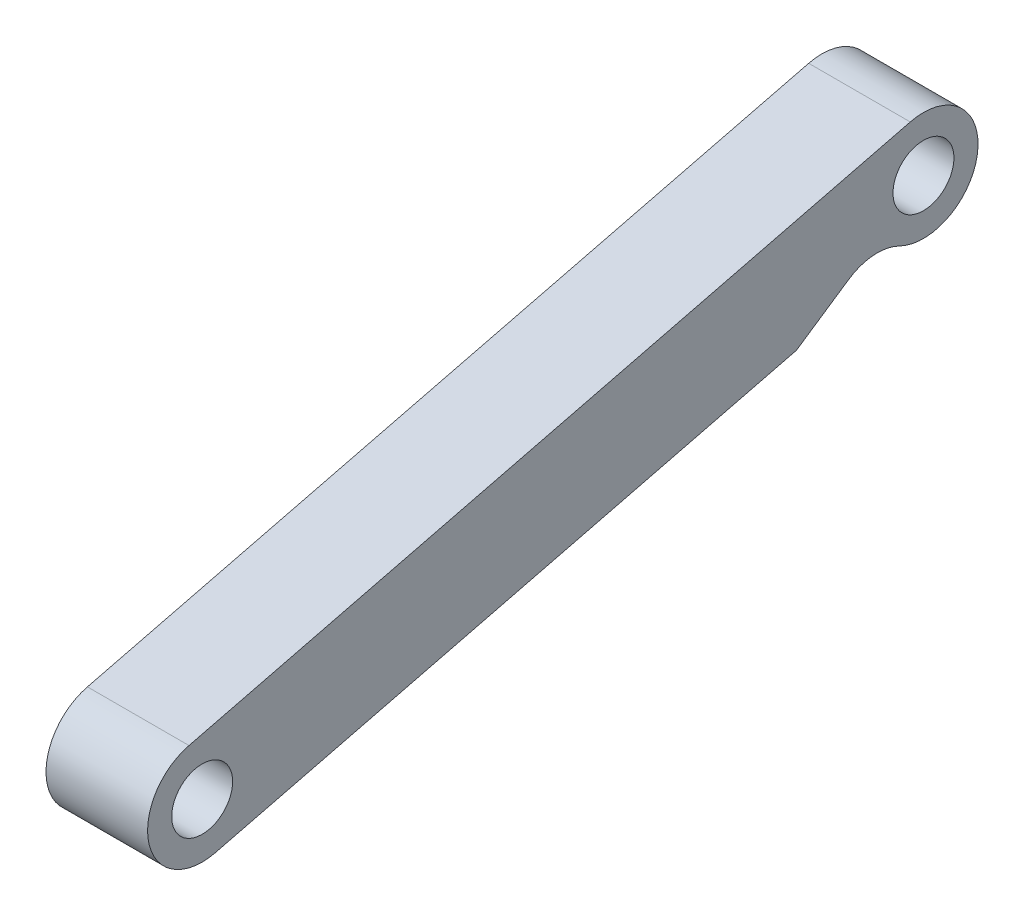
ISO-10303-21;
HEADER;
FILE_DESCRIPTION(('STEP AP214'),'2;1');
FILE_NAME('part.step','',(''),(''),'','','');
FILE_SCHEMA(('AUTOMOTIVE_DESIGN { 1 0 10303 214 1 1 1 1 }'));
ENDSEC;
DATA;
#1=APPLICATION_CONTEXT('core data for automotive mechanical design processes');
#2=APPLICATION_PROTOCOL_DEFINITION('international standard','automotive_design',2000,#1);
#3=PRODUCT_CONTEXT('',#1,'mechanical');
#4=PRODUCT('Part','Part','',(#3));
#5=PRODUCT_RELATED_PRODUCT_CATEGORY('part','',(#4));
#6=PRODUCT_DEFINITION_FORMATION('','',#4);
#7=PRODUCT_DEFINITION_CONTEXT('part definition',#1,'design');
#8=PRODUCT_DEFINITION('design','',#6,#7);
#9=PRODUCT_DEFINITION_SHAPE('','',#8);
#10=(LENGTH_UNIT() NAMED_UNIT(*) SI_UNIT(.MILLI.,.METRE.));
#11=(NAMED_UNIT(*) PLANE_ANGLE_UNIT() SI_UNIT($,.RADIAN.));
#12=(NAMED_UNIT(*) SI_UNIT($,.STERADIAN.) SOLID_ANGLE_UNIT());
#13=UNCERTAINTY_MEASURE_WITH_UNIT(LENGTH_MEASURE(1.E-05),#10,'distance_accuracy_value','');
#14=(GEOMETRIC_REPRESENTATION_CONTEXT(3) GLOBAL_UNCERTAINTY_ASSIGNED_CONTEXT((#13)) GLOBAL_UNIT_ASSIGNED_CONTEXT((#10,
#11,#12)) REPRESENTATION_CONTEXT('',''));
#15=CARTESIAN_POINT('',(0.,0.,0.));
#16=DIRECTION('',(0.,0.,1.));
#17=DIRECTION('',(1.,0.,0.));
#18=AXIS2_PLACEMENT_3D('',#15,#16,#17);
#19=CARTESIAN_POINT('',(-2.,-11.142986567367,-2.77146766811159));
#20=DIRECTION('',(0.,-0.970434393018363,-0.241365053077453));
#21=DIRECTION('',(0.,0.241365053077453,-0.970434393018363));
#22=AXIS2_PLACEMENT_3D('',#19,#20,#21);
#23=PLANE('',#22);
#24=DIRECTION('',(1.,0.,0.));
#25=VECTOR('',#24,1.);
#26=CARTESIAN_POINT('',(-2.,-1.91356605501053,-39.879354574779));
#27=LINE('',#26,#25);
#28=CARTESIAN_POINT('',(-2.,-1.91356605501053,-39.879354574779));
#29=VERTEX_POINT('',#28);
#30=CARTESIAN_POINT('',(2.,-1.91356605501053,-39.879354574779));
#31=VERTEX_POINT('',#30);
#32=EDGE_CURVE('E41',#29,#31,#27,.T.);
#33=ORIENTED_EDGE('',*,*,#32,.T.);
#34=DIRECTION('',(0.,0.241365053077453,-0.970434393018363));
#35=VECTOR('',#34,1.);
#36=CARTESIAN_POINT('',(2.,-11.142986567367,-2.77146766811159));
#37=LINE('',#36,#35);
#38=CARTESIAN_POINT('',(2.,5.15061171746536,-68.2816480360722));
#39=VERTEX_POINT('',#38);
#40=EDGE_CURVE('E94',#31,#39,#37,.T.);
#41=ORIENTED_EDGE('',*,*,#40,.T.);
#42=DIRECTION('',(1.,0.,0.));
#43=VECTOR('',#42,1.);
#44=CARTESIAN_POINT('',(-2.,5.15061171746536,-68.2816480360722));
#45=LINE('',#44,#43);
#46=CARTESIAN_POINT('',(-2.,5.15061171746536,-68.2816480360722));
#47=VERTEX_POINT('',#46);
#48=EDGE_CURVE('E11',#47,#39,#45,.T.);
#49=ORIENTED_EDGE('',*,*,#48,.F.);
#50=DIRECTION('',(0.,0.241365053077453,-0.970434393018363));
#51=VECTOR('',#50,1.);
#52=CARTESIAN_POINT('',(-2.,-11.142986567367,-2.77146766811159));
#53=LINE('',#52,#51);
#54=EDGE_CURVE('E54',#29,#47,#53,.T.);
#55=ORIENTED_EDGE('',*,*,#54,.F.);
#56=EDGE_LOOP('',(#33,#41,#49,#55));
#57=FACE_BOUND('',#56,.T.);
#58=ADVANCED_FACE('F38',(#57),#23,.F.);
#59=CARTESIAN_POINT('',(-2.,3.06417777247588,-68.8005829001888));
#60=DIRECTION('',(1.,0.,0.));
#61=DIRECTION('',(0.,0.,-1.));
#62=AXIS2_PLACEMENT_3D('',#59,#60,#61);
#63=CYLINDRICAL_SURFACE('',#62,2.15);
#64=ORIENTED_EDGE('',*,*,#48,.T.);
#65=CARTESIAN_POINT('',(2.,3.06417777247588,-68.8005829001888));
#66=DIRECTION('',(1.,0.,0.));
#67=DIRECTION('',(0.,0.,-1.));
#68=AXIS2_PLACEMENT_3D('',#65,#66,#67);
#69=CIRCLE('',#68,2.15);
#70=CARTESIAN_POINT('',(2.,1.13224759562641,-67.8571075206593));
#71=VERTEX_POINT('',#70);
#72=EDGE_CURVE('E111',#71,#39,#69,.T.);
#73=ORIENTED_EDGE('',*,*,#72,.F.);
#74=DIRECTION('',(1.,0.,0.));
#75=VECTOR('',#74,1.);
#76=CARTESIAN_POINT('',(-2.,1.13224759562641,-67.8571075206593));
#77=LINE('',#76,#75);
#78=CARTESIAN_POINT('',(-2.,1.13224759562641,-67.8571075206593));
#79=VERTEX_POINT('',#78);
#80=EDGE_CURVE('E46',#79,#71,#77,.T.);
#81=ORIENTED_EDGE('',*,*,#80,.F.);
#82=CARTESIAN_POINT('',(-2.,3.06417777247588,-68.8005829001888));
#83=DIRECTION('',(1.,0.,0.));
#84=DIRECTION('',(0.,0.,-1.));
#85=AXIS2_PLACEMENT_3D('',#82,#83,#84);
#86=CIRCLE('',#85,2.15);
#87=EDGE_CURVE('E139',#79,#47,#86,.T.);
#88=ORIENTED_EDGE('',*,*,#87,.T.);
#89=EDGE_LOOP('',(#64,#73,#81,#88));
#90=FACE_BOUND('',#89,.T.);
#91=ADVANCED_FACE('F160',(#90),#63,.T.);
#92=CARTESIAN_POINT('',(-2.,-0.664896754931248,-66.9794560048178));
#93=DIRECTION('',(1.,0.,0.));
#94=DIRECTION('',(0.,0.,-1.));
#95=AXIS2_PLACEMENT_3D('',#92,#93,#94);
#96=CYLINDRICAL_SURFACE('',#95,2.);
#97=ORIENTED_EDGE('',*,*,#80,.T.);
#98=CARTESIAN_POINT('',(2.,-0.664896754931248,-66.9794560048178));
#99=DIRECTION('',(1.,0.,0.));
#100=DIRECTION('',(0.,0.,-1.));
#101=AXIS2_PLACEMENT_3D('',#98,#99,#100);
#102=CIRCLE('',#101,2.);
#103=CARTESIAN_POINT('',(2.,0.993819901126462,-65.8620218658563));
#104=VERTEX_POINT('',#103);
#105=EDGE_CURVE('E118',#71,#104,#102,.T.);
#106=ORIENTED_EDGE('',*,*,#105,.T.);
#107=DIRECTION('',(1.,0.,0.));
#108=VECTOR('',#107,1.);
#109=CARTESIAN_POINT('',(-2.,0.993819901126462,-65.8620218658563));
#110=LINE('',#109,#108);
#111=CARTESIAN_POINT('',(-2.,0.993819901126462,-65.8620218658563));
#112=VERTEX_POINT('',#111);
#113=EDGE_CURVE('E147',#112,#104,#110,.T.);
#114=ORIENTED_EDGE('',*,*,#113,.F.);
#115=CARTESIAN_POINT('',(-2.,-0.664896754931248,-66.9794560048178));
#116=DIRECTION('',(1.,0.,0.));
#117=DIRECTION('',(0.,0.,-1.));
#118=AXIS2_PLACEMENT_3D('',#115,#116,#117);
#119=CIRCLE('',#118,2.);
#120=EDGE_CURVE('E137',#79,#112,#119,.T.);
#121=ORIENTED_EDGE('',*,*,#120,.F.);
#122=EDGE_LOOP('',(#97,#106,#114,#121));
#123=FACE_BOUND('',#122,.T.);
#124=ADVANCED_FACE('F159',(#123),#96,.F.);
#125=CARTESIAN_POINT('',(-2.,-29.8353390099526,-20.0992895534372));
#126=DIRECTION('',(0.,-0.829358328028849,-0.558717069480781));
#127=DIRECTION('',(0.,0.558717069480781,-0.829358328028849));
#128=AXIS2_PLACEMENT_3D('',#125,#126,#127);
#129=PLANE('',#128);
#130=ORIENTED_EDGE('',*,*,#113,.T.);
#131=DIRECTION('',(0.,0.558717069480781,-0.829358328028849));
#132=VECTOR('',#131,1.);
#133=CARTESIAN_POINT('',(2.,-29.8353390099526,-20.0992895534372));
#134=LINE('',#133,#132);
#135=CARTESIAN_POINT('',(2.,-0.394917751690836,-63.8005829001888));
#136=VERTEX_POINT('',#135);
#137=EDGE_CURVE('E115',#136,#104,#134,.T.);
#138=ORIENTED_EDGE('',*,*,#137,.F.);
#139=DIRECTION('',(1.,0.,0.));
#140=VECTOR('',#139,1.);
#141=CARTESIAN_POINT('',(-2.,-0.394917751690836,-63.8005829001888));
#142=LINE('',#141,#140);
#143=CARTESIAN_POINT('',(-2.,-0.394917751690836,-63.8005829001888));
#144=VERTEX_POINT('',#143);
#145=EDGE_CURVE('E149',#144,#136,#142,.T.);
#146=ORIENTED_EDGE('',*,*,#145,.F.);
#147=DIRECTION('',(0.,0.558717069480781,-0.829358328028849));
#148=VECTOR('',#147,1.);
#149=CARTESIAN_POINT('',(-2.,-29.8353390099526,-20.0992895534372));
#150=LINE('',#149,#148);
#151=EDGE_CURVE('E134',#144,#112,#150,.T.);
#152=ORIENTED_EDGE('',*,*,#151,.T.);
#153=EDGE_LOOP('',(#130,#138,#146,#152));
#154=FACE_BOUND('',#153,.T.);
#155=ADVANCED_FACE('F156',(#154),#129,.T.);
#156=CARTESIAN_POINT('',(-2.,-15.315854457346,-3.80933739634463));
#157=DIRECTION('',(0.,-0.970434393018363,-0.241365053077453));
#158=DIRECTION('',(0.,0.241365053077453,-0.970434393018363));
#159=AXIS2_PLACEMENT_3D('',#156,#157,#158);
#160=PLANE('',#159);
#161=ORIENTED_EDGE('',*,*,#145,.T.);
#162=DIRECTION('',(0.,0.241365053077453,-0.970434393018363));
#163=VECTOR('',#162,1.);
#164=CARTESIAN_POINT('',(2.,-15.315854457346,-3.80933739634463));
#165=LINE('',#164,#163);
#166=CARTESIAN_POINT('',(2.,-6.08643394498948,-40.917224303012));
#167=VERTEX_POINT('',#166);
#168=EDGE_CURVE('E105',#167,#136,#165,.T.);
#169=ORIENTED_EDGE('',*,*,#168,.F.);
#170=DIRECTION('',(1.,0.,0.));
#171=VECTOR('',#170,1.);
#172=CARTESIAN_POINT('',(-2.,-6.08643394498948,-40.917224303012));
#173=LINE('',#172,#171);
#174=CARTESIAN_POINT('',(-2.,-6.08643394498948,-40.917224303012));
#175=VERTEX_POINT('',#174);
#176=EDGE_CURVE('E97',#175,#167,#173,.T.);
#177=ORIENTED_EDGE('',*,*,#176,.F.);
#178=DIRECTION('',(0.,0.241365053077453,-0.970434393018363));
#179=VECTOR('',#178,1.);
#180=CARTESIAN_POINT('',(-2.,-15.315854457346,-3.80933739634463));
#181=LINE('',#180,#179);
#182=EDGE_CURVE('E131',#175,#144,#181,.T.);
#183=ORIENTED_EDGE('',*,*,#182,.T.);
#184=EDGE_LOOP('',(#161,#169,#177,#183));
#185=FACE_BOUND('',#184,.T.);
#186=ADVANCED_FACE('F151',(#185),#160,.T.);
#187=CARTESIAN_POINT('',(-2.,3.06417777247588,-68.8005829001888));
#188=DIRECTION('',(1.,0.,0.));
#189=DIRECTION('',(0.,0.,-1.));
#190=AXIS2_PLACEMENT_3D('',#187,#188,#189);
#191=CYLINDRICAL_SURFACE('',#190,1.2);
#192=CARTESIAN_POINT('',(-2.,3.06417777247588,-68.8005829001888));
#193=DIRECTION('',(1.,0.,0.));
#194=DIRECTION('',(0.,0.,-1.));
#195=AXIS2_PLACEMENT_3D('',#192,#193,#194);
#196=CIRCLE('',#195,1.2);
#197=CARTESIAN_POINT('',(-2.,3.06417777247588,-70.0005829001888));
#198=VERTEX_POINT('',#197);
#199=EDGE_CURVE('E141',#198,#198,#196,.T.);
#200=ORIENTED_EDGE('',*,*,#199,.F.);
#201=EDGE_LOOP('',(#200));
#202=FACE_BOUND('',#201,.T.);
#203=CARTESIAN_POINT('',(2.,3.06417777247588,-68.8005829001888));
#204=DIRECTION('',(1.,0.,0.));
#205=DIRECTION('',(0.,0.,-1.));
#206=AXIS2_PLACEMENT_3D('',#203,#204,#205);
#207=CIRCLE('',#206,1.2);
#208=CARTESIAN_POINT('',(2.,3.06417777247588,-70.0005829001888));
#209=VERTEX_POINT('',#208);
#210=EDGE_CURVE('E122',#209,#209,#207,.T.);
#211=ORIENTED_EDGE('',*,*,#210,.T.);
#212=EDGE_LOOP('',(#211));
#213=FACE_BOUND('',#212,.T.);
#214=ADVANCED_FACE('F189',(#202,#213),#191,.F.);
#215=CARTESIAN_POINT('',(-2.,-4.00000000000001,-40.3982894388955));
#216=DIRECTION('',(1.,0.,0.));
#217=DIRECTION('',(0.,0.,-1.));
#218=AXIS2_PLACEMENT_3D('',#215,#216,#217);
#219=CYLINDRICAL_SURFACE('',#218,2.15);
#220=ORIENTED_EDGE('',*,*,#176,.T.);
#221=CARTESIAN_POINT('',(2.,-4.00000000000001,-40.3982894388955));
#222=DIRECTION('',(1.,0.,0.));
#223=DIRECTION('',(0.,0.,-1.));
#224=AXIS2_PLACEMENT_3D('',#221,#222,#223);
#225=CIRCLE('',#224,2.15);
#226=EDGE_CURVE('E100',#31,#167,#225,.T.);
#227=ORIENTED_EDGE('',*,*,#226,.F.);
#228=ORIENTED_EDGE('',*,*,#32,.F.);
#229=CARTESIAN_POINT('',(-2.,-4.00000000000001,-40.3982894388955));
#230=DIRECTION('',(1.,0.,0.));
#231=DIRECTION('',(0.,0.,-1.));
#232=AXIS2_PLACEMENT_3D('',#229,#230,#231);
#233=CIRCLE('',#232,2.15);
#234=EDGE_CURVE('E129',#29,#175,#233,.T.);
#235=ORIENTED_EDGE('',*,*,#234,.T.);
#236=EDGE_LOOP('',(#220,#227,#228,#235));
#237=FACE_BOUND('',#236,.T.);
#238=ADVANCED_FACE('F101',(#237),#219,.T.);
#239=CARTESIAN_POINT('',(-2.,-4.00000000000001,-40.3982894388955));
#240=DIRECTION('',(1.,0.,0.));
#241=DIRECTION('',(0.,0.,-1.));
#242=AXIS2_PLACEMENT_3D('',#239,#240,#241);
#243=CYLINDRICAL_SURFACE('',#242,1.2);
#244=CARTESIAN_POINT('',(-2.,-4.00000000000001,-40.3982894388955));
#245=DIRECTION('',(1.,0.,0.));
#246=DIRECTION('',(0.,0.,-1.));
#247=AXIS2_PLACEMENT_3D('',#244,#245,#246);
#248=CIRCLE('',#247,1.2);
#249=CARTESIAN_POINT('',(-2.,-4.00000000000001,-41.5982894388955));
#250=VERTEX_POINT('',#249);
#251=EDGE_CURVE('E98',#250,#250,#248,.T.);
#252=ORIENTED_EDGE('',*,*,#251,.F.);
#253=EDGE_LOOP('',(#252));
#254=FACE_BOUND('',#253,.T.);
#255=CARTESIAN_POINT('',(2.,-4.00000000000001,-40.3982894388955));
#256=DIRECTION('',(1.,0.,0.));
#257=DIRECTION('',(0.,0.,-1.));
#258=AXIS2_PLACEMENT_3D('',#255,#256,#257);
#259=CIRCLE('',#258,1.2);
#260=CARTESIAN_POINT('',(2.,-4.00000000000001,-41.5982894388955));
#261=VERTEX_POINT('',#260);
#262=EDGE_CURVE('E125',#261,#261,#259,.T.);
#263=ORIENTED_EDGE('',*,*,#262,.T.);
#264=EDGE_LOOP('',(#263));
#265=FACE_BOUND('',#264,.T.);
#266=ADVANCED_FACE('F164',(#254,#265),#243,.F.);
#267=CARTESIAN_POINT('',(-2.,0.,0.));
#268=DIRECTION('',(1.,0.,0.));
#269=DIRECTION('',(0.,0.,-1.));
#270=AXIS2_PLACEMENT_3D('',#267,#268,#269);
#271=PLANE('',#270);
#272=ORIENTED_EDGE('',*,*,#54,.T.);
#273=ORIENTED_EDGE('',*,*,#87,.F.);
#274=ORIENTED_EDGE('',*,*,#120,.T.);
#275=ORIENTED_EDGE('',*,*,#151,.F.);
#276=ORIENTED_EDGE('',*,*,#182,.F.);
#277=ORIENTED_EDGE('',*,*,#234,.F.);
#278=EDGE_LOOP('',(#272,#273,#274,#275,#276,#277));
#279=FACE_BOUND('',#278,.T.);
#280=ORIENTED_EDGE('',*,*,#199,.T.);
#281=EDGE_LOOP('',(#280));
#282=FACE_BOUND('',#281,.T.);
#283=ORIENTED_EDGE('',*,*,#251,.T.);
#284=EDGE_LOOP('',(#283));
#285=FACE_BOUND('',#284,.T.);
#286=ADVANCED_FACE('F161',(#279,#282,#285),#271,.F.);
#287=CARTESIAN_POINT('',(2.,0.,0.));
#288=DIRECTION('',(1.,0.,0.));
#289=DIRECTION('',(0.,0.,-1.));
#290=AXIS2_PLACEMENT_3D('',#287,#288,#289);
#291=PLANE('',#290);
#292=ORIENTED_EDGE('',*,*,#40,.F.);
#293=ORIENTED_EDGE('',*,*,#226,.T.);
#294=ORIENTED_EDGE('',*,*,#168,.T.);
#295=ORIENTED_EDGE('',*,*,#137,.T.);
#296=ORIENTED_EDGE('',*,*,#105,.F.);
#297=ORIENTED_EDGE('',*,*,#72,.T.);
#298=EDGE_LOOP('',(#292,#293,#294,#295,#296,#297));
#299=FACE_BOUND('',#298,.T.);
#300=ORIENTED_EDGE('',*,*,#210,.F.);
#301=EDGE_LOOP('',(#300));
#302=FACE_BOUND('',#301,.T.);
#303=ORIENTED_EDGE('',*,*,#262,.F.);
#304=EDGE_LOOP('',(#303));
#305=FACE_BOUND('',#304,.T.);
#306=ADVANCED_FACE('F108',(#299,#302,#305),#291,.T.);
#307=CLOSED_SHELL('',(#58,#91,#124,#155,#186,#214,#238,#266,#286,#306));
#308=MANIFOLD_SOLID_BREP('B2',#307);
#309=ADVANCED_BREP_SHAPE_REPRESENTATION('',(#18,#308),#14);
#310=SHAPE_DEFINITION_REPRESENTATION(#9,#309);
ENDSEC;
END-ISO-10303-21;
